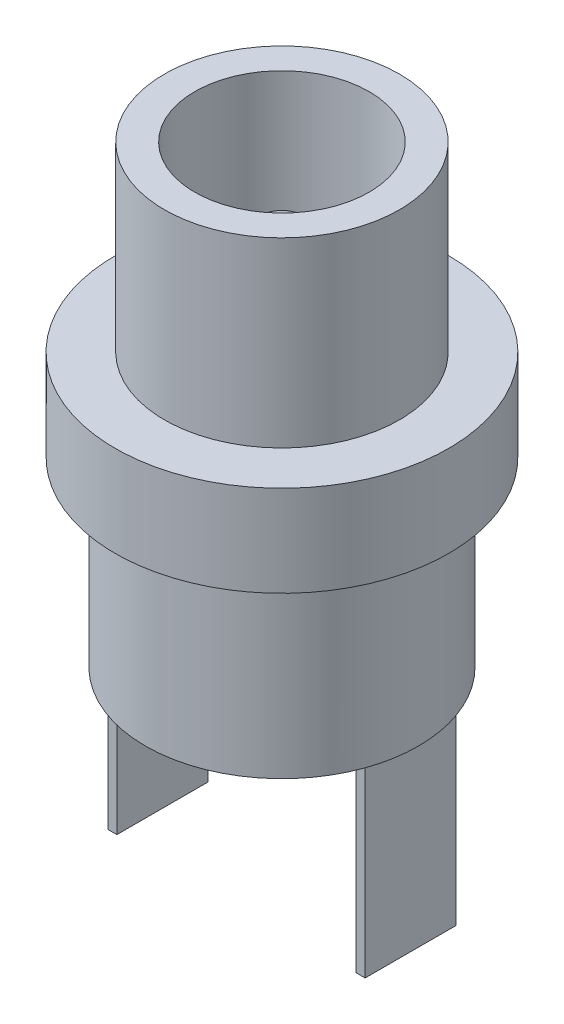
ISO-10303-21;
HEADER;
FILE_DESCRIPTION(('STEP AP214'),'2;1');
FILE_NAME('part.step','',(''),(''),'','','');
FILE_SCHEMA(('AUTOMOTIVE_DESIGN { 1 0 10303 214 1 1 1 1 }'));
ENDSEC;
DATA;
#1=APPLICATION_CONTEXT('core data for automotive mechanical design processes');
#2=APPLICATION_PROTOCOL_DEFINITION('international standard','automotive_design',2000,#1);
#3=PRODUCT_CONTEXT('',#1,'mechanical');
#4=PRODUCT('Part','Part','',(#3));
#5=PRODUCT_RELATED_PRODUCT_CATEGORY('part','',(#4));
#6=PRODUCT_DEFINITION_FORMATION('','',#4);
#7=PRODUCT_DEFINITION_CONTEXT('part definition',#1,'design');
#8=PRODUCT_DEFINITION('design','',#6,#7);
#9=PRODUCT_DEFINITION_SHAPE('','',#8);
#10=(LENGTH_UNIT() NAMED_UNIT(*) SI_UNIT(.MILLI.,.METRE.));
#11=(NAMED_UNIT(*) PLANE_ANGLE_UNIT() SI_UNIT($,.RADIAN.));
#12=(NAMED_UNIT(*) SI_UNIT($,.STERADIAN.) SOLID_ANGLE_UNIT());
#13=UNCERTAINTY_MEASURE_WITH_UNIT(LENGTH_MEASURE(1.E-05),#10,'distance_accuracy_value','');
#14=(GEOMETRIC_REPRESENTATION_CONTEXT(3) GLOBAL_UNCERTAINTY_ASSIGNED_CONTEXT((#13)) GLOBAL_UNIT_ASSIGNED_CONTEXT((#10,
#11,#12)) REPRESENTATION_CONTEXT('',''));
#15=CARTESIAN_POINT('',(0.,0.,0.));
#16=DIRECTION('',(0.,0.,1.));
#17=DIRECTION('',(1.,0.,0.));
#18=AXIS2_PLACEMENT_3D('',#15,#16,#17);
#19=CARTESIAN_POINT('',(-4.5,-15.,0.));
#20=DIRECTION('',(0.,1.,0.));
#21=DIRECTION('',(0.,0.,1.));
#22=AXIS2_PLACEMENT_3D('',#19,#20,#21);
#23=PLANE('',#22);
#24=DIRECTION('',(0.,0.,1.));
#25=VECTOR('',#24,1.);
#26=CARTESIAN_POINT('',(1.5,-15.,-3.94264068711928));
#27=LINE('',#26,#25);
#28=CARTESIAN_POINT('',(1.5,-15.,-4.24264068711928));
#29=VERTEX_POINT('',#28);
#30=CARTESIAN_POINT('',(1.5,-15.,-3.94264068711928));
#31=VERTEX_POINT('',#30);
#32=EDGE_CURVE('E156',#29,#31,#27,.T.);
#33=ORIENTED_EDGE('',*,*,#32,.F.);
#34=CARTESIAN_POINT('',(0.,-15.,0.));
#35=DIRECTION('',(0.,-1.,0.));
#36=DIRECTION('',(0.,0.,-1.));
#37=AXIS2_PLACEMENT_3D('',#34,#35,#36);
#38=CIRCLE('',#37,4.5);
#39=CARTESIAN_POINT('',(4.24264068711928,-15.,-1.5));
#40=VERTEX_POINT('',#39);
#41=EDGE_CURVE('E243',#29,#40,#38,.T.);
#42=ORIENTED_EDGE('',*,*,#41,.T.);
#43=DIRECTION('',(1.,0.,0.));
#44=VECTOR('',#43,1.);
#45=CARTESIAN_POINT('',(3.94264068711928,-15.,-1.5));
#46=LINE('',#45,#44);
#47=CARTESIAN_POINT('',(3.94264068711928,-15.,-1.5));
#48=VERTEX_POINT('',#47);
#49=EDGE_CURVE('E159',#48,#40,#46,.T.);
#50=ORIENTED_EDGE('',*,*,#49,.F.);
#51=DIRECTION('',(0.,0.,-1.));
#52=VECTOR('',#51,1.);
#53=CARTESIAN_POINT('',(3.94264068711928,-15.,1.5));
#54=LINE('',#53,#52);
#55=CARTESIAN_POINT('',(3.94264068711928,-15.,1.5));
#56=VERTEX_POINT('',#55);
#57=EDGE_CURVE('E160',#56,#48,#54,.T.);
#58=ORIENTED_EDGE('',*,*,#57,.F.);
#59=DIRECTION('',(-1.,0.,0.));
#60=VECTOR('',#59,1.);
#61=CARTESIAN_POINT('',(3.94264068711928,-15.,1.5));
#62=LINE('',#61,#60);
#63=CARTESIAN_POINT('',(4.24264068711928,-15.,1.5));
#64=VERTEX_POINT('',#63);
#65=EDGE_CURVE('E167',#64,#56,#62,.T.);
#66=ORIENTED_EDGE('',*,*,#65,.F.);
#67=CARTESIAN_POINT('',(-4.24264068711928,-15.,1.5));
#68=VERTEX_POINT('',#67);
#69=EDGE_CURVE('E240',#64,#68,#38,.T.);
#70=ORIENTED_EDGE('',*,*,#69,.T.);
#71=DIRECTION('',(-1.,0.,0.));
#72=VECTOR('',#71,1.);
#73=CARTESIAN_POINT('',(-4.24264068711928,-15.,1.5));
#74=LINE('',#73,#72);
#75=CARTESIAN_POINT('',(-3.94264068711928,-15.,1.5));
#76=VERTEX_POINT('',#75);
#77=EDGE_CURVE('E197',#76,#68,#74,.T.);
#78=ORIENTED_EDGE('',*,*,#77,.F.);
#79=DIRECTION('',(0.,0.,1.));
#80=VECTOR('',#79,1.);
#81=CARTESIAN_POINT('',(-3.94264068711928,-15.,1.5));
#82=LINE('',#81,#80);
#83=CARTESIAN_POINT('',(-3.94264068711928,-15.,-1.5));
#84=VERTEX_POINT('',#83);
#85=EDGE_CURVE('E212',#84,#76,#82,.T.);
#86=ORIENTED_EDGE('',*,*,#85,.F.);
#87=DIRECTION('',(1.,0.,0.));
#88=VECTOR('',#87,1.);
#89=CARTESIAN_POINT('',(-4.24264068711928,-15.,-1.5));
#90=LINE('',#89,#88);
#91=CARTESIAN_POINT('',(-4.24264068711928,-15.,-1.5));
#92=VERTEX_POINT('',#91);
#93=EDGE_CURVE('E209',#92,#84,#90,.T.);
#94=ORIENTED_EDGE('',*,*,#93,.F.);
#95=CARTESIAN_POINT('',(-1.5,-15.,-4.24264068711928));
#96=VERTEX_POINT('',#95);
#97=EDGE_CURVE('E245',#92,#96,#38,.T.);
#98=ORIENTED_EDGE('',*,*,#97,.T.);
#99=DIRECTION('',(0.,0.,-1.));
#100=VECTOR('',#99,1.);
#101=CARTESIAN_POINT('',(-1.5,-15.,-3.94264068711928));
#102=LINE('',#101,#100);
#103=CARTESIAN_POINT('',(-1.5,-15.,-3.94264068711928));
#104=VERTEX_POINT('',#103);
#105=EDGE_CURVE('E65',#104,#96,#102,.T.);
#106=ORIENTED_EDGE('',*,*,#105,.F.);
#107=DIRECTION('',(-1.,0.,0.));
#108=VECTOR('',#107,1.);
#109=CARTESIAN_POINT('',(1.5,-15.,-3.94264068711928));
#110=LINE('',#109,#108);
#111=EDGE_CURVE('E58',#31,#104,#110,.T.);
#112=ORIENTED_EDGE('',*,*,#111,.F.);
#113=EDGE_LOOP('',(#33,#42,#50,#58,#66,#70,#78,#86,#94,#98,#106,#112));
#114=FACE_BOUND('',#113,.T.);
#115=ADVANCED_FACE('F44',(#114),#23,.F.);
#116=DIRECTION('',(1.,0.,0.));
#117=VECTOR('',#116,1.);
#118=CARTESIAN_POINT('',(1.5,-15.,-4.24264068711928));
#119=LINE('',#118,#117);
#120=EDGE_CURVE('E155',#96,#29,#119,.T.);
#121=ORIENTED_EDGE('',*,*,#120,.F.);
#122=EDGE_CURVE('E529',#96,#29,#38,.T.);
#123=ORIENTED_EDGE('',*,*,#122,.T.);
#124=EDGE_LOOP('',(#121,#123));
#125=FACE_BOUND('',#124,.T.);
#126=ADVANCED_FACE('F271',(#125),#23,.F.);
#127=DIRECTION('',(0.,0.,1.));
#128=VECTOR('',#127,1.);
#129=CARTESIAN_POINT('',(4.24264068711928,-15.,1.5));
#130=LINE('',#129,#128);
#131=EDGE_CURVE('E177',#40,#64,#130,.T.);
#132=ORIENTED_EDGE('',*,*,#131,.F.);
#133=EDGE_CURVE('E535',#40,#64,#38,.T.);
#134=ORIENTED_EDGE('',*,*,#133,.T.);
#135=EDGE_LOOP('',(#132,#134));
#136=FACE_BOUND('',#135,.T.);
#137=ADVANCED_FACE('F280',(#136),#23,.F.);
#138=DIRECTION('',(0.,0.,-1.));
#139=VECTOR('',#138,1.);
#140=CARTESIAN_POINT('',(-4.24264068711928,-15.,1.5));
#141=LINE('',#140,#139);
#142=EDGE_CURVE('E195',#68,#92,#141,.T.);
#143=ORIENTED_EDGE('',*,*,#142,.F.);
#144=EDGE_CURVE('E238',#68,#92,#38,.T.);
#145=ORIENTED_EDGE('',*,*,#144,.T.);
#146=EDGE_LOOP('',(#143,#145));
#147=FACE_BOUND('',#146,.T.);
#148=ADVANCED_FACE('F273',(#147),#23,.F.);
#149=CARTESIAN_POINT('',(-2.875,0.,0.));
#150=DIRECTION('',(0.,-1.,0.));
#151=DIRECTION('',(0.,0.,-1.));
#152=AXIS2_PLACEMENT_3D('',#149,#150,#151);
#153=PLANE('',#152);
#154=CARTESIAN_POINT('',(0.,0.,0.));
#155=DIRECTION('',(0.,-1.,0.));
#156=DIRECTION('',(0.,0.,-1.));
#157=AXIS2_PLACEMENT_3D('',#154,#155,#156);
#158=CIRCLE('',#157,3.875);
#159=CARTESIAN_POINT('',(0.,0.,-3.875));
#160=VERTEX_POINT('',#159);
#161=EDGE_CURVE('E253',#160,#160,#158,.T.);
#162=ORIENTED_EDGE('',*,*,#161,.F.);
#163=EDGE_LOOP('',(#162));
#164=FACE_BOUND('',#163,.T.);
#165=CARTESIAN_POINT('',(0.,0.,0.));
#166=DIRECTION('',(0.,-1.,0.));
#167=DIRECTION('',(0.,0.,-1.));
#168=AXIS2_PLACEMENT_3D('',#165,#166,#167);
#169=CIRCLE('',#168,2.875);
#170=CARTESIAN_POINT('',(0.,0.,-2.875));
#171=VERTEX_POINT('',#170);
#172=EDGE_CURVE('E226',#171,#171,#169,.T.);
#173=ORIENTED_EDGE('',*,*,#172,.T.);
#174=EDGE_LOOP('',(#173));
#175=FACE_BOUND('',#174,.T.);
#176=ADVANCED_FACE('F282',(#164,#175),#153,.F.);
#177=CARTESIAN_POINT('',(0.,-15.,0.));
#178=DIRECTION('',(0.,-1.,0.));
#179=DIRECTION('',(0.,0.,-1.));
#180=AXIS2_PLACEMENT_3D('',#177,#178,#179);
#181=CYLINDRICAL_SURFACE('',#180,3.875);
#182=CARTESIAN_POINT('',(0.,-6.,0.));
#183=DIRECTION('',(0.,-1.,0.));
#184=DIRECTION('',(0.,0.,-1.));
#185=AXIS2_PLACEMENT_3D('',#182,#183,#184);
#186=CIRCLE('',#185,3.875);
#187=CARTESIAN_POINT('',(0.,-6.,-3.875));
#188=VERTEX_POINT('',#187);
#189=EDGE_CURVE('E255',#188,#188,#186,.T.);
#190=ORIENTED_EDGE('',*,*,#189,.F.);
#191=EDGE_LOOP('',(#190));
#192=FACE_BOUND('',#191,.T.);
#193=ORIENTED_EDGE('',*,*,#161,.T.);
#194=EDGE_LOOP('',(#193));
#195=FACE_BOUND('',#194,.T.);
#196=ADVANCED_FACE('F292',(#192,#195),#181,.T.);
#197=CARTESIAN_POINT('',(-3.875,-6.,0.));
#198=DIRECTION('',(0.,-1.,0.));
#199=DIRECTION('',(0.,0.,-1.));
#200=AXIS2_PLACEMENT_3D('',#197,#198,#199);
#201=PLANE('',#200);
#202=CARTESIAN_POINT('',(0.,-6.,0.));
#203=DIRECTION('',(0.,-1.,0.));
#204=DIRECTION('',(0.,0.,-1.));
#205=AXIS2_PLACEMENT_3D('',#202,#203,#204);
#206=CIRCLE('',#205,5.5);
#207=CARTESIAN_POINT('',(0.,-6.,-5.5));
#208=VERTEX_POINT('',#207);
#209=EDGE_CURVE('E248',#208,#208,#206,.T.);
#210=ORIENTED_EDGE('',*,*,#209,.F.);
#211=EDGE_LOOP('',(#210));
#212=FACE_BOUND('',#211,.T.);
#213=ORIENTED_EDGE('',*,*,#189,.T.);
#214=EDGE_LOOP('',(#213));
#215=FACE_BOUND('',#214,.T.);
#216=ADVANCED_FACE('F354',(#212,#215),#201,.F.);
#217=CARTESIAN_POINT('',(0.,-15.,0.));
#218=DIRECTION('',(0.,-1.,0.));
#219=DIRECTION('',(0.,0.,-1.));
#220=AXIS2_PLACEMENT_3D('',#217,#218,#219);
#221=CYLINDRICAL_SURFACE('',#220,5.5);
#222=CARTESIAN_POINT('',(0.,-9.,0.));
#223=DIRECTION('',(0.,-1.,0.));
#224=DIRECTION('',(0.,0.,-1.));
#225=AXIS2_PLACEMENT_3D('',#222,#223,#224);
#226=CIRCLE('',#225,5.5);
#227=CARTESIAN_POINT('',(0.,-9.,-5.5));
#228=VERTEX_POINT('',#227);
#229=EDGE_CURVE('E246',#228,#228,#226,.T.);
#230=ORIENTED_EDGE('',*,*,#229,.F.);
#231=EDGE_LOOP('',(#230));
#232=FACE_BOUND('',#231,.T.);
#233=ORIENTED_EDGE('',*,*,#209,.T.);
#234=EDGE_LOOP('',(#233));
#235=FACE_BOUND('',#234,.T.);
#236=ADVANCED_FACE('F348',(#232,#235),#221,.T.);
#237=CARTESIAN_POINT('',(-5.5,-9.,0.));
#238=DIRECTION('',(0.,1.,0.));
#239=DIRECTION('',(0.,0.,1.));
#240=AXIS2_PLACEMENT_3D('',#237,#238,#239);
#241=PLANE('',#240);
#242=CARTESIAN_POINT('',(0.,-9.,0.));
#243=DIRECTION('',(0.,-1.,0.));
#244=DIRECTION('',(0.,0.,-1.));
#245=AXIS2_PLACEMENT_3D('',#242,#243,#244);
#246=CIRCLE('',#245,4.5);
#247=CARTESIAN_POINT('',(0.,-9.,-4.5));
#248=VERTEX_POINT('',#247);
#249=EDGE_CURVE('E241',#248,#248,#246,.T.);
#250=ORIENTED_EDGE('',*,*,#249,.F.);
#251=EDGE_LOOP('',(#250));
#252=FACE_BOUND('',#251,.T.);
#253=ORIENTED_EDGE('',*,*,#229,.T.);
#254=EDGE_LOOP('',(#253));
#255=FACE_BOUND('',#254,.T.);
#256=ADVANCED_FACE('F345',(#252,#255),#241,.F.);
#257=CARTESIAN_POINT('',(0.,-15.,0.));
#258=DIRECTION('',(0.,-1.,0.));
#259=DIRECTION('',(0.,0.,-1.));
#260=AXIS2_PLACEMENT_3D('',#257,#258,#259);
#261=CYLINDRICAL_SURFACE('',#260,4.5);
#262=ORIENTED_EDGE('',*,*,#144,.F.);
#263=ORIENTED_EDGE('',*,*,#69,.F.);
#264=ORIENTED_EDGE('',*,*,#133,.F.);
#265=ORIENTED_EDGE('',*,*,#41,.F.);
#266=ORIENTED_EDGE('',*,*,#122,.F.);
#267=ORIENTED_EDGE('',*,*,#97,.F.);
#268=EDGE_LOOP('',(#262,#263,#264,#265,#266,#267));
#269=FACE_BOUND('',#268,.T.);
#270=ORIENTED_EDGE('',*,*,#249,.T.);
#271=EDGE_LOOP('',(#270));
#272=FACE_BOUND('',#271,.T.);
#273=ADVANCED_FACE('F305',(#269,#272),#261,.T.);
#274=CARTESIAN_POINT('',(0.,-2.3,0.));
#275=DIRECTION('',(0.,-1.,0.));
#276=DIRECTION('',(0.,0.,-1.));
#277=AXIS2_PLACEMENT_3D('',#274,#275,#276);
#278=PLANE('',#277);
#279=CARTESIAN_POINT('',(0.,-2.3,0.));
#280=DIRECTION('',(0.,-1.,0.));
#281=DIRECTION('',(0.,0.,-1.));
#282=AXIS2_PLACEMENT_3D('',#279,#280,#281);
#283=CIRCLE('',#282,0.25);
#284=CARTESIAN_POINT('',(0.,-2.3,-0.25));
#285=VERTEX_POINT('',#284);
#286=EDGE_CURVE('E11',#285,#285,#283,.F.);
#287=ORIENTED_EDGE('',*,*,#286,.T.);
#288=EDGE_LOOP('',(#287));
#289=FACE_BOUND('',#288,.T.);
#290=ADVANCED_FACE('F339',(#289),#278,.F.);
#291=CARTESIAN_POINT('',(0.,-15.,0.));
#292=DIRECTION('',(0.,-1.,0.));
#293=DIRECTION('',(0.,0.,-1.));
#294=AXIS2_PLACEMENT_3D('',#291,#292,#293);
#295=CYLINDRICAL_SURFACE('',#294,1.);
#296=CARTESIAN_POINT('',(0.,-3.05,0.));
#297=DIRECTION('',(0.,-1.,0.));
#298=DIRECTION('',(0.,0.,-1.));
#299=AXIS2_PLACEMENT_3D('',#296,#297,#298);
#300=CIRCLE('',#299,1.);
#301=CARTESIAN_POINT('',(0.,-3.05,-1.));
#302=VERTEX_POINT('',#301);
#303=EDGE_CURVE('E52',#302,#302,#300,.T.);
#304=ORIENTED_EDGE('',*,*,#303,.T.);
#305=EDGE_LOOP('',(#304));
#306=FACE_BOUND('',#305,.T.);
#307=CARTESIAN_POINT('',(0.,-10.,0.));
#308=DIRECTION('',(0.,-1.,0.));
#309=DIRECTION('',(0.,0.,-1.));
#310=AXIS2_PLACEMENT_3D('',#307,#308,#309);
#311=CIRCLE('',#310,0.999999999999999);
#312=CARTESIAN_POINT('',(0.,-10.,-0.999999999999999));
#313=VERTEX_POINT('',#312);
#314=EDGE_CURVE('E234',#313,#313,#311,.T.);
#315=ORIENTED_EDGE('',*,*,#314,.F.);
#316=EDGE_LOOP('',(#315));
#317=FACE_BOUND('',#316,.T.);
#318=ADVANCED_FACE('F260',(#306,#317),#295,.T.);
#319=CARTESIAN_POINT('',(-0.999999999999999,-10.,0.));
#320=DIRECTION('',(0.,-1.,0.));
#321=DIRECTION('',(0.,0.,-1.));
#322=AXIS2_PLACEMENT_3D('',#319,#320,#321);
#323=PLANE('',#322);
#324=CARTESIAN_POINT('',(0.,-10.,0.));
#325=DIRECTION('',(0.,-1.,0.));
#326=DIRECTION('',(0.,0.,-1.));
#327=AXIS2_PLACEMENT_3D('',#324,#325,#326);
#328=CIRCLE('',#327,2.875);
#329=CARTESIAN_POINT('',(0.,-10.,-2.875));
#330=VERTEX_POINT('',#329);
#331=EDGE_CURVE('E233',#330,#330,#328,.T.);
#332=ORIENTED_EDGE('',*,*,#331,.F.);
#333=EDGE_LOOP('',(#332));
#334=FACE_BOUND('',#333,.T.);
#335=ORIENTED_EDGE('',*,*,#314,.T.);
#336=EDGE_LOOP('',(#335));
#337=FACE_BOUND('',#336,.T.);
#338=ADVANCED_FACE('F332',(#334,#337),#323,.F.);
#339=CARTESIAN_POINT('',(0.,-15.,0.));
#340=DIRECTION('',(0.,-1.,0.));
#341=DIRECTION('',(0.,0.,-1.));
#342=AXIS2_PLACEMENT_3D('',#339,#340,#341);
#343=CYLINDRICAL_SURFACE('',#342,2.875);
#344=ORIENTED_EDGE('',*,*,#172,.F.);
#345=EDGE_LOOP('',(#344));
#346=FACE_BOUND('',#345,.T.);
#347=ORIENTED_EDGE('',*,*,#331,.T.);
#348=EDGE_LOOP('',(#347));
#349=FACE_BOUND('',#348,.T.);
#350=ADVANCED_FACE('F328',(#346,#349),#343,.F.);
#351=CARTESIAN_POINT('',(-4.24264068711928,-21.,1.5));
#352=DIRECTION('',(1.,0.,0.));
#353=DIRECTION('',(0.,0.,-1.));
#354=AXIS2_PLACEMENT_3D('',#351,#352,#353);
#355=PLANE('',#354);
#356=ORIENTED_EDGE('',*,*,#142,.T.);
#357=DIRECTION('',(0.,1.,0.));
#358=VECTOR('',#357,1.);
#359=CARTESIAN_POINT('',(-4.24264068711928,-21.,-1.5));
#360=LINE('',#359,#358);
#361=CARTESIAN_POINT('',(-4.24264068711928,-21.,-1.5));
#362=VERTEX_POINT('',#361);
#363=EDGE_CURVE('E224',#362,#92,#360,.T.);
#364=ORIENTED_EDGE('',*,*,#363,.F.);
#365=DIRECTION('',(0.,0.,-1.));
#366=VECTOR('',#365,1.);
#367=CARTESIAN_POINT('',(-4.24264068711928,-21.,1.5));
#368=LINE('',#367,#366);
#369=CARTESIAN_POINT('',(-4.24264068711928,-21.,1.5));
#370=VERTEX_POINT('',#369);
#371=EDGE_CURVE('E199',#370,#362,#368,.T.);
#372=ORIENTED_EDGE('',*,*,#371,.F.);
#373=DIRECTION('',(0.,1.,0.));
#374=VECTOR('',#373,1.);
#375=CARTESIAN_POINT('',(-4.24264068711928,-21.,1.5));
#376=LINE('',#375,#374);
#377=EDGE_CURVE('E207',#370,#68,#376,.T.);
#378=ORIENTED_EDGE('',*,*,#377,.T.);
#379=EDGE_LOOP('',(#356,#364,#372,#378));
#380=FACE_BOUND('',#379,.T.);
#381=ADVANCED_FACE('F312',(#380),#355,.F.);
#382=CARTESIAN_POINT('',(-4.24264068711928,-21.,-1.5));
#383=DIRECTION('',(0.,0.,1.));
#384=DIRECTION('',(1.,0.,0.));
#385=AXIS2_PLACEMENT_3D('',#382,#383,#384);
#386=PLANE('',#385);
#387=ORIENTED_EDGE('',*,*,#93,.T.);
#388=DIRECTION('',(0.,1.,0.));
#389=VECTOR('',#388,1.);
#390=CARTESIAN_POINT('',(-3.94264068711928,-21.,-1.5));
#391=LINE('',#390,#389);
#392=CARTESIAN_POINT('',(-3.94264068711928,-21.,-1.5));
#393=VERTEX_POINT('',#392);
#394=EDGE_CURVE('E225',#393,#84,#391,.T.);
#395=ORIENTED_EDGE('',*,*,#394,.F.);
#396=DIRECTION('',(1.,0.,0.));
#397=VECTOR('',#396,1.);
#398=CARTESIAN_POINT('',(-4.24264068711928,-21.,-1.5));
#399=LINE('',#398,#397);
#400=EDGE_CURVE('E198',#362,#393,#399,.T.);
#401=ORIENTED_EDGE('',*,*,#400,.F.);
#402=ORIENTED_EDGE('',*,*,#363,.T.);
#403=EDGE_LOOP('',(#387,#395,#401,#402));
#404=FACE_BOUND('',#403,.T.);
#405=ADVANCED_FACE('F321',(#404),#386,.F.);
#406=CARTESIAN_POINT('',(-3.94264068711928,-21.,1.5));
#407=DIRECTION('',(-1.,0.,0.));
#408=DIRECTION('',(0.,0.,1.));
#409=AXIS2_PLACEMENT_3D('',#406,#407,#408);
#410=PLANE('',#409);
#411=ORIENTED_EDGE('',*,*,#85,.T.);
#412=DIRECTION('',(0.,1.,0.));
#413=VECTOR('',#412,1.);
#414=CARTESIAN_POINT('',(-3.94264068711928,-21.,1.5));
#415=LINE('',#414,#413);
#416=CARTESIAN_POINT('',(-3.94264068711928,-21.,1.5));
#417=VERTEX_POINT('',#416);
#418=EDGE_CURVE('E218',#417,#76,#415,.T.);
#419=ORIENTED_EDGE('',*,*,#418,.F.);
#420=DIRECTION('',(0.,0.,1.));
#421=VECTOR('',#420,1.);
#422=CARTESIAN_POINT('',(-3.94264068711928,-21.,1.5));
#423=LINE('',#422,#421);
#424=EDGE_CURVE('E205',#393,#417,#423,.T.);
#425=ORIENTED_EDGE('',*,*,#424,.F.);
#426=ORIENTED_EDGE('',*,*,#394,.T.);
#427=EDGE_LOOP('',(#411,#419,#425,#426));
#428=FACE_BOUND('',#427,.T.);
#429=ADVANCED_FACE('F316',(#428),#410,.F.);
#430=CARTESIAN_POINT('',(-4.24264068711928,-21.,1.5));
#431=DIRECTION('',(0.,0.,-1.));
#432=DIRECTION('',(-1.,0.,0.));
#433=AXIS2_PLACEMENT_3D('',#430,#431,#432);
#434=PLANE('',#433);
#435=ORIENTED_EDGE('',*,*,#77,.T.);
#436=ORIENTED_EDGE('',*,*,#377,.F.);
#437=DIRECTION('',(-1.,0.,0.));
#438=VECTOR('',#437,1.);
#439=CARTESIAN_POINT('',(-4.24264068711928,-21.,1.5));
#440=LINE('',#439,#438);
#441=EDGE_CURVE('E202',#417,#370,#440,.T.);
#442=ORIENTED_EDGE('',*,*,#441,.F.);
#443=ORIENTED_EDGE('',*,*,#418,.T.);
#444=EDGE_LOOP('',(#435,#436,#442,#443));
#445=FACE_BOUND('',#444,.T.);
#446=ADVANCED_FACE('F307',(#445),#434,.F.);
#447=CARTESIAN_POINT('',(0.,-21.,0.));
#448=DIRECTION('',(0.,-1.,0.));
#449=DIRECTION('',(0.,0.,-1.));
#450=AXIS2_PLACEMENT_3D('',#447,#448,#449);
#451=PLANE('',#450);
#452=ORIENTED_EDGE('',*,*,#371,.T.);
#453=ORIENTED_EDGE('',*,*,#400,.T.);
#454=ORIENTED_EDGE('',*,*,#424,.T.);
#455=ORIENTED_EDGE('',*,*,#441,.T.);
#456=EDGE_LOOP('',(#452,#453,#454,#455));
#457=FACE_BOUND('',#456,.T.);
#458=ADVANCED_FACE('F314',(#457),#451,.T.);
#459=CARTESIAN_POINT('',(3.94264068711928,-21.,1.5));
#460=DIRECTION('',(1.,0.,0.));
#461=DIRECTION('',(0.,0.,-1.));
#462=AXIS2_PLACEMENT_3D('',#459,#460,#461);
#463=PLANE('',#462);
#464=ORIENTED_EDGE('',*,*,#57,.T.);
#465=DIRECTION('',(0.,1.,0.));
#466=VECTOR('',#465,1.);
#467=CARTESIAN_POINT('',(3.94264068711928,-21.,-1.5));
#468=LINE('',#467,#466);
#469=CARTESIAN_POINT('',(3.94264068711928,-21.,-1.5));
#470=VERTEX_POINT('',#469);
#471=EDGE_CURVE('E192',#470,#48,#468,.T.);
#472=ORIENTED_EDGE('',*,*,#471,.F.);
#473=DIRECTION('',(0.,0.,-1.));
#474=VECTOR('',#473,1.);
#475=CARTESIAN_POINT('',(3.94264068711928,-21.,1.5));
#476=LINE('',#475,#474);
#477=CARTESIAN_POINT('',(3.94264068711928,-21.,1.5));
#478=VERTEX_POINT('',#477);
#479=EDGE_CURVE('E168',#478,#470,#476,.T.);
#480=ORIENTED_EDGE('',*,*,#479,.F.);
#481=DIRECTION('',(0.,1.,0.));
#482=VECTOR('',#481,1.);
#483=CARTESIAN_POINT('',(3.94264068711928,-21.,1.5));
#484=LINE('',#483,#482);
#485=EDGE_CURVE('E174',#478,#56,#484,.T.);
#486=ORIENTED_EDGE('',*,*,#485,.T.);
#487=EDGE_LOOP('',(#464,#472,#480,#486));
#488=FACE_BOUND('',#487,.T.);
#489=ADVANCED_FACE('F444',(#488),#463,.F.);
#490=CARTESIAN_POINT('',(3.94264068711928,-21.,-1.5));
#491=DIRECTION('',(0.,0.,1.));
#492=DIRECTION('',(1.,0.,0.));
#493=AXIS2_PLACEMENT_3D('',#490,#491,#492);
#494=PLANE('',#493);
#495=ORIENTED_EDGE('',*,*,#49,.T.);
#496=DIRECTION('',(0.,1.,0.));
#497=VECTOR('',#496,1.);
#498=CARTESIAN_POINT('',(4.24264068711928,-21.,-1.5));
#499=LINE('',#498,#497);
#500=CARTESIAN_POINT('',(4.24264068711928,-21.,-1.5));
#501=VERTEX_POINT('',#500);
#502=EDGE_CURVE('E186',#501,#40,#499,.T.);
#503=ORIENTED_EDGE('',*,*,#502,.F.);
#504=DIRECTION('',(1.,0.,0.));
#505=VECTOR('',#504,1.);
#506=CARTESIAN_POINT('',(3.94264068711928,-21.,-1.5));
#507=LINE('',#506,#505);
#508=EDGE_CURVE('E169',#470,#501,#507,.T.);
#509=ORIENTED_EDGE('',*,*,#508,.F.);
#510=ORIENTED_EDGE('',*,*,#471,.T.);
#511=EDGE_LOOP('',(#495,#503,#509,#510));
#512=FACE_BOUND('',#511,.T.);
#513=ADVANCED_FACE('F452',(#512),#494,.F.);
#514=CARTESIAN_POINT('',(4.24264068711928,-21.,1.5));
#515=DIRECTION('',(-1.,0.,0.));
#516=DIRECTION('',(0.,0.,1.));
#517=AXIS2_PLACEMENT_3D('',#514,#515,#516);
#518=PLANE('',#517);
#519=ORIENTED_EDGE('',*,*,#131,.T.);
#520=DIRECTION('',(0.,1.,0.));
#521=VECTOR('',#520,1.);
#522=CARTESIAN_POINT('',(4.24264068711928,-21.,1.5));
#523=LINE('',#522,#521);
#524=CARTESIAN_POINT('',(4.24264068711928,-21.,1.5));
#525=VERTEX_POINT('',#524);
#526=EDGE_CURVE('E187',#525,#64,#523,.T.);
#527=ORIENTED_EDGE('',*,*,#526,.F.);
#528=DIRECTION('',(0.,0.,1.));
#529=VECTOR('',#528,1.);
#530=CARTESIAN_POINT('',(4.24264068711928,-21.,1.5));
#531=LINE('',#530,#529);
#532=EDGE_CURVE('E175',#501,#525,#531,.T.);
#533=ORIENTED_EDGE('',*,*,#532,.F.);
#534=ORIENTED_EDGE('',*,*,#502,.T.);
#535=EDGE_LOOP('',(#519,#527,#533,#534));
#536=FACE_BOUND('',#535,.T.);
#537=ADVANCED_FACE('F457',(#536),#518,.F.);
#538=CARTESIAN_POINT('',(3.94264068711928,-21.,1.5));
#539=DIRECTION('',(0.,0.,-1.));
#540=DIRECTION('',(-1.,0.,0.));
#541=AXIS2_PLACEMENT_3D('',#538,#539,#540);
#542=PLANE('',#541);
#543=ORIENTED_EDGE('',*,*,#65,.T.);
#544=ORIENTED_EDGE('',*,*,#485,.F.);
#545=DIRECTION('',(-1.,0.,0.));
#546=VECTOR('',#545,1.);
#547=CARTESIAN_POINT('',(3.94264068711928,-21.,1.5));
#548=LINE('',#547,#546);
#549=EDGE_CURVE('E172',#525,#478,#548,.T.);
#550=ORIENTED_EDGE('',*,*,#549,.F.);
#551=ORIENTED_EDGE('',*,*,#526,.T.);
#552=EDGE_LOOP('',(#543,#544,#550,#551));
#553=FACE_BOUND('',#552,.T.);
#554=ADVANCED_FACE('F466',(#553),#542,.F.);
#555=CARTESIAN_POINT('',(0.,-21.,0.));
#556=DIRECTION('',(0.,-1.,0.));
#557=DIRECTION('',(0.,0.,-1.));
#558=AXIS2_PLACEMENT_3D('',#555,#556,#557);
#559=PLANE('',#558);
#560=ORIENTED_EDGE('',*,*,#479,.T.);
#561=ORIENTED_EDGE('',*,*,#508,.T.);
#562=ORIENTED_EDGE('',*,*,#532,.T.);
#563=ORIENTED_EDGE('',*,*,#549,.T.);
#564=EDGE_LOOP('',(#560,#561,#562,#563));
#565=FACE_BOUND('',#564,.T.);
#566=ADVANCED_FACE('F479',(#565),#559,.T.);
#567=CARTESIAN_POINT('',(1.5,-21.,-3.94264068711928));
#568=DIRECTION('',(-1.,0.,0.));
#569=DIRECTION('',(0.,0.,1.));
#570=AXIS2_PLACEMENT_3D('',#567,#568,#569);
#571=PLANE('',#570);
#572=ORIENTED_EDGE('',*,*,#32,.T.);
#573=DIRECTION('',(0.,1.,0.));
#574=VECTOR('',#573,1.);
#575=CARTESIAN_POINT('',(1.5,-21.,-3.94264068711928));
#576=LINE('',#575,#574);
#577=CARTESIAN_POINT('',(1.5,-21.,-3.94264068711928));
#578=VERTEX_POINT('',#577);
#579=EDGE_CURVE('E140',#578,#31,#576,.T.);
#580=ORIENTED_EDGE('',*,*,#579,.F.);
#581=DIRECTION('',(0.,0.,1.));
#582=VECTOR('',#581,1.);
#583=CARTESIAN_POINT('',(1.5,-21.,-3.94264068711928));
#584=LINE('',#583,#582);
#585=CARTESIAN_POINT('',(1.5,-21.,-4.24264068711928));
#586=VERTEX_POINT('',#585);
#587=EDGE_CURVE('E144',#586,#578,#584,.T.);
#588=ORIENTED_EDGE('',*,*,#587,.F.);
#589=DIRECTION('',(0.,1.,0.));
#590=VECTOR('',#589,1.);
#591=CARTESIAN_POINT('',(1.5,-21.,-4.24264068711928));
#592=LINE('',#591,#590);
#593=EDGE_CURVE('E524',#586,#29,#592,.T.);
#594=ORIENTED_EDGE('',*,*,#593,.T.);
#595=EDGE_LOOP('',(#572,#580,#588,#594));
#596=FACE_BOUND('',#595,.T.);
#597=ADVANCED_FACE('F152',(#596),#571,.F.);
#598=CARTESIAN_POINT('',(1.5,-21.,-3.94264068711928));
#599=DIRECTION('',(0.,0.,-1.));
#600=DIRECTION('',(-1.,0.,0.));
#601=AXIS2_PLACEMENT_3D('',#598,#599,#600);
#602=PLANE('',#601);
#603=ORIENTED_EDGE('',*,*,#111,.T.);
#604=DIRECTION('',(0.,1.,0.));
#605=VECTOR('',#604,1.);
#606=CARTESIAN_POINT('',(-1.5,-21.,-3.94264068711928));
#607=LINE('',#606,#605);
#608=CARTESIAN_POINT('',(-1.5,-21.,-3.94264068711928));
#609=VERTEX_POINT('',#608);
#610=EDGE_CURVE('E139',#609,#104,#607,.T.);
#611=ORIENTED_EDGE('',*,*,#610,.F.);
#612=DIRECTION('',(-1.,0.,0.));
#613=VECTOR('',#612,1.);
#614=CARTESIAN_POINT('',(1.5,-21.,-3.94264068711928));
#615=LINE('',#614,#613);
#616=EDGE_CURVE('E135',#578,#609,#615,.T.);
#617=ORIENTED_EDGE('',*,*,#616,.F.);
#618=ORIENTED_EDGE('',*,*,#579,.T.);
#619=EDGE_LOOP('',(#603,#611,#617,#618));
#620=FACE_BOUND('',#619,.T.);
#621=ADVANCED_FACE('F132',(#620),#602,.F.);
#622=CARTESIAN_POINT('',(-1.5,-21.,-3.94264068711928));
#623=DIRECTION('',(1.,0.,0.));
#624=DIRECTION('',(0.,0.,-1.));
#625=AXIS2_PLACEMENT_3D('',#622,#623,#624);
#626=PLANE('',#625);
#627=ORIENTED_EDGE('',*,*,#105,.T.);
#628=DIRECTION('',(0.,1.,0.));
#629=VECTOR('',#628,1.);
#630=CARTESIAN_POINT('',(-1.5,-21.,-4.24264068711928));
#631=LINE('',#630,#629);
#632=CARTESIAN_POINT('',(-1.5,-21.,-4.24264068711928));
#633=VERTEX_POINT('',#632);
#634=EDGE_CURVE('E162',#633,#96,#631,.T.);
#635=ORIENTED_EDGE('',*,*,#634,.F.);
#636=DIRECTION('',(0.,0.,-1.));
#637=VECTOR('',#636,1.);
#638=CARTESIAN_POINT('',(-1.5,-21.,-3.94264068711928));
#639=LINE('',#638,#637);
#640=EDGE_CURVE('E141',#609,#633,#639,.T.);
#641=ORIENTED_EDGE('',*,*,#640,.F.);
#642=ORIENTED_EDGE('',*,*,#610,.T.);
#643=EDGE_LOOP('',(#627,#635,#641,#642));
#644=FACE_BOUND('',#643,.T.);
#645=ADVANCED_FACE('F500',(#644),#626,.F.);
#646=CARTESIAN_POINT('',(1.5,-21.,-4.24264068711928));
#647=DIRECTION('',(0.,0.,1.));
#648=DIRECTION('',(1.,0.,0.));
#649=AXIS2_PLACEMENT_3D('',#646,#647,#648);
#650=PLANE('',#649);
#651=ORIENTED_EDGE('',*,*,#120,.T.);
#652=ORIENTED_EDGE('',*,*,#593,.F.);
#653=DIRECTION('',(1.,0.,0.));
#654=VECTOR('',#653,1.);
#655=CARTESIAN_POINT('',(1.5,-21.,-4.24264068711928));
#656=LINE('',#655,#654);
#657=EDGE_CURVE('E148',#633,#586,#656,.T.);
#658=ORIENTED_EDGE('',*,*,#657,.F.);
#659=ORIENTED_EDGE('',*,*,#634,.T.);
#660=EDGE_LOOP('',(#651,#652,#658,#659));
#661=FACE_BOUND('',#660,.T.);
#662=ADVANCED_FACE('F267',(#661),#650,.F.);
#663=CARTESIAN_POINT('',(0.,-21.,0.));
#664=DIRECTION('',(0.,1.,0.));
#665=DIRECTION('',(0.,0.,1.));
#666=AXIS2_PLACEMENT_3D('',#663,#664,#665);
#667=PLANE('',#666);
#668=ORIENTED_EDGE('',*,*,#587,.T.);
#669=ORIENTED_EDGE('',*,*,#616,.T.);
#670=ORIENTED_EDGE('',*,*,#640,.T.);
#671=ORIENTED_EDGE('',*,*,#657,.T.);
#672=EDGE_LOOP('',(#668,#669,#670,#671));
#673=FACE_BOUND('',#672,.T.);
#674=ADVANCED_FACE('F147',(#673),#667,.F.);
#675=CARTESIAN_POINT('',(0.,-3.05,0.));
#676=DIRECTION('',(0.,-1.,0.));
#677=DIRECTION('',(0.,0.,-1.));
#678=AXIS2_PLACEMENT_3D('',#675,#676,#677);
#679=DEGENERATE_TOROIDAL_SURFACE('',#678,0.25,0.75,.T.);
#680=ORIENTED_EDGE('',*,*,#286,.F.);
#681=EDGE_LOOP('',(#680));
#682=FACE_BOUND('',#681,.T.);
#683=ORIENTED_EDGE('',*,*,#303,.F.);
#684=EDGE_LOOP('',(#683));
#685=FACE_BOUND('',#684,.T.);
#686=ADVANCED_FACE('F50',(#682,#685),#679,.T.);
#687=CLOSED_SHELL('',(#115,#126,#137,#148,#176,#196,#216,#236,#256,#273,#290,#318,#338,#350,
#381,#405,#429,#446,#458,#489,#513,#537,#554,#566,#597,#621,#645,#662,#674,#686));
#688=MANIFOLD_SOLID_BREP('B2',#687);
#689=ADVANCED_BREP_SHAPE_REPRESENTATION('',(#18,#688),#14);
#690=SHAPE_DEFINITION_REPRESENTATION(#9,#689);
ENDSEC;
END-ISO-10303-21;
